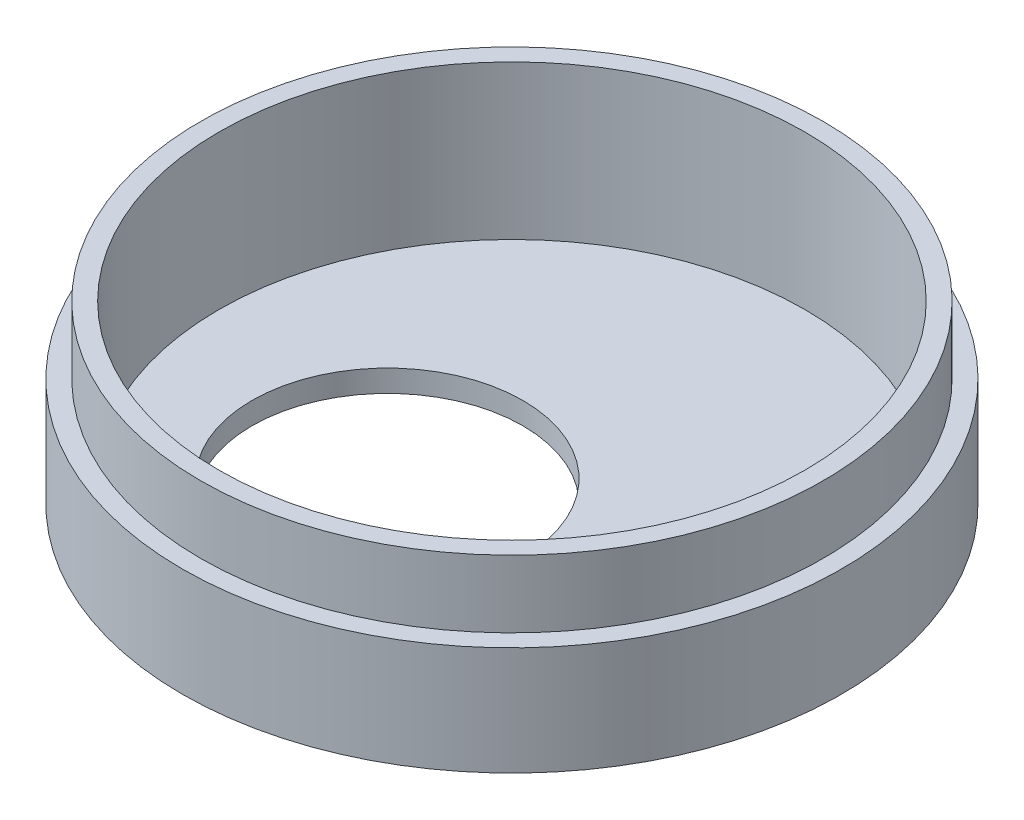
ISO-10303-21;
HEADER;
FILE_DESCRIPTION(('STEP AP214'),'2;1');
FILE_NAME('part.step','',(''),(''),'','','');
FILE_SCHEMA(('AUTOMOTIVE_DESIGN { 1 0 10303 214 1 1 1 1 }'));
ENDSEC;
DATA;
#1=APPLICATION_CONTEXT('core data for automotive mechanical design processes');
#2=APPLICATION_PROTOCOL_DEFINITION('international standard','automotive_design',2000,#1);
#3=PRODUCT_CONTEXT('',#1,'mechanical');
#4=PRODUCT('Part','Part','',(#3));
#5=PRODUCT_RELATED_PRODUCT_CATEGORY('part','',(#4));
#6=PRODUCT_DEFINITION_FORMATION('','',#4);
#7=PRODUCT_DEFINITION_CONTEXT('part definition',#1,'design');
#8=PRODUCT_DEFINITION('design','',#6,#7);
#9=PRODUCT_DEFINITION_SHAPE('','',#8);
#10=(LENGTH_UNIT() NAMED_UNIT(*) SI_UNIT(.MILLI.,.METRE.));
#11=(NAMED_UNIT(*) PLANE_ANGLE_UNIT() SI_UNIT($,.RADIAN.));
#12=(NAMED_UNIT(*) SI_UNIT($,.STERADIAN.) SOLID_ANGLE_UNIT());
#13=UNCERTAINTY_MEASURE_WITH_UNIT(LENGTH_MEASURE(1.E-05),#10,'distance_accuracy_value','');
#14=(GEOMETRIC_REPRESENTATION_CONTEXT(3) GLOBAL_UNCERTAINTY_ASSIGNED_CONTEXT((#13)) GLOBAL_UNIT_ASSIGNED_CONTEXT((#10,
#11,#12)) REPRESENTATION_CONTEXT('',''));
#15=CARTESIAN_POINT('',(0.,0.,0.));
#16=DIRECTION('',(0.,0.,1.));
#17=DIRECTION('',(1.,0.,0.));
#18=AXIS2_PLACEMENT_3D('',#15,#16,#17);
#19=CARTESIAN_POINT('',(0.,-6.00075,0.));
#20=DIRECTION('',(0.,-1.,0.));
#21=DIRECTION('',(0.,0.,-1.));
#22=AXIS2_PLACEMENT_3D('',#19,#20,#21);
#23=PLANE('',#22);
#24=CARTESIAN_POINT('',(-4.318,-6.00075,4.318));
#25=DIRECTION('',(0.,-1.,0.));
#26=DIRECTION('',(0.,0.,-1.));
#27=AXIS2_PLACEMENT_3D('',#24,#25,#26);
#28=CIRCLE('',#27,9.398);
#29=CARTESIAN_POINT('',(-4.318,-6.00075,-5.08));
#30=VERTEX_POINT('',#29);
#31=EDGE_CURVE('E54',#30,#30,#28,.T.);
#32=ORIENTED_EDGE('',*,*,#31,.T.);
#33=EDGE_LOOP('',(#32));
#34=FACE_BOUND('',#33,.T.);
#35=CARTESIAN_POINT('',(0.,-6.00075,0.));
#36=DIRECTION('',(0.,-1.,0.));
#37=DIRECTION('',(0.,0.,-1.));
#38=AXIS2_PLACEMENT_3D('',#35,#36,#37);
#39=CIRCLE('',#38,20.32);
#40=CARTESIAN_POINT('',(0.,-6.00075,-20.32));
#41=VERTEX_POINT('',#40);
#42=EDGE_CURVE('E10',#41,#41,#39,.T.);
#43=ORIENTED_EDGE('',*,*,#42,.F.);
#44=EDGE_LOOP('',(#43));
#45=FACE_BOUND('',#44,.T.);
#46=ADVANCED_FACE('F35',(#34,#45),#23,.F.);
#47=CARTESIAN_POINT('',(0.,33.2676701737178,0.));
#48=DIRECTION('',(0.,1.,0.));
#49=DIRECTION('',(0.,0.,1.));
#50=AXIS2_PLACEMENT_3D('',#47,#48,#49);
#51=CYLINDRICAL_SURFACE('',#50,22.86);
#52=CARTESIAN_POINT('',(0.,0.,0.));
#53=DIRECTION('',(0.,1.,0.));
#54=DIRECTION('',(0.,0.,1.));
#55=AXIS2_PLACEMENT_3D('',#52,#53,#54);
#56=CIRCLE('',#55,22.86);
#57=CARTESIAN_POINT('',(0.,0.,22.86));
#58=VERTEX_POINT('',#57);
#59=EDGE_CURVE('E42',#58,#58,#56,.T.);
#60=ORIENTED_EDGE('',*,*,#59,.F.);
#61=EDGE_LOOP('',(#60));
#62=FACE_BOUND('',#61,.T.);
#63=CARTESIAN_POINT('',(0.,-7.52475,0.));
#64=DIRECTION('',(0.,1.,0.));
#65=DIRECTION('',(0.,0.,1.));
#66=AXIS2_PLACEMENT_3D('',#63,#64,#65);
#67=CIRCLE('',#66,22.86);
#68=CARTESIAN_POINT('',(0.,-7.52475,22.86));
#69=VERTEX_POINT('',#68);
#70=EDGE_CURVE('E46',#69,#69,#67,.T.);
#71=ORIENTED_EDGE('',*,*,#70,.T.);
#72=EDGE_LOOP('',(#71));
#73=FACE_BOUND('',#72,.T.);
#74=ADVANCED_FACE('F37',(#62,#73),#51,.T.);
#75=CARTESIAN_POINT('',(22.86,-7.52475,0.));
#76=DIRECTION('',(0.,1.,0.));
#77=DIRECTION('',(0.,0.,1.));
#78=AXIS2_PLACEMENT_3D('',#75,#76,#77);
#79=PLANE('',#78);
#80=CARTESIAN_POINT('',(-4.318,-7.52475,4.318));
#81=DIRECTION('',(0.,-1.,0.));
#82=DIRECTION('',(0.,0.,-1.));
#83=AXIS2_PLACEMENT_3D('',#80,#81,#82);
#84=CIRCLE('',#83,9.398);
#85=CARTESIAN_POINT('',(-4.318,-7.52475,-5.08));
#86=VERTEX_POINT('',#85);
#87=EDGE_CURVE('E57',#86,#86,#84,.T.);
#88=ORIENTED_EDGE('',*,*,#87,.F.);
#89=EDGE_LOOP('',(#88));
#90=FACE_BOUND('',#89,.T.);
#91=ORIENTED_EDGE('',*,*,#70,.F.);
#92=EDGE_LOOP('',(#91));
#93=FACE_BOUND('',#92,.T.);
#94=ADVANCED_FACE('F87',(#90,#93),#79,.F.);
#95=CARTESIAN_POINT('',(0.,33.2676701737178,0.));
#96=DIRECTION('',(0.,1.,0.));
#97=DIRECTION('',(0.,0.,1.));
#98=AXIS2_PLACEMENT_3D('',#95,#96,#97);
#99=CYLINDRICAL_SURFACE('',#98,21.59);
#100=CARTESIAN_POINT('',(0.,0.,0.));
#101=DIRECTION('',(0.,1.,0.));
#102=DIRECTION('',(0.,0.,1.));
#103=AXIS2_PLACEMENT_3D('',#100,#101,#102);
#104=CIRCLE('',#103,21.59);
#105=CARTESIAN_POINT('',(0.,0.,21.59));
#106=VERTEX_POINT('',#105);
#107=EDGE_CURVE('E51',#106,#106,#104,.T.);
#108=ORIENTED_EDGE('',*,*,#107,.T.);
#109=EDGE_LOOP('',(#108));
#110=FACE_BOUND('',#109,.T.);
#111=CARTESIAN_POINT('',(0.,4.66725,0.));
#112=DIRECTION('',(0.,1.,0.));
#113=DIRECTION('',(0.,0.,1.));
#114=AXIS2_PLACEMENT_3D('',#111,#112,#113);
#115=CIRCLE('',#114,21.59);
#116=CARTESIAN_POINT('',(0.,4.66725,21.59));
#117=VERTEX_POINT('',#116);
#118=EDGE_CURVE('E56',#117,#117,#115,.T.);
#119=ORIENTED_EDGE('',*,*,#118,.F.);
#120=EDGE_LOOP('',(#119));
#121=FACE_BOUND('',#120,.T.);
#122=ADVANCED_FACE('F72',(#110,#121),#99,.T.);
#123=CARTESIAN_POINT('',(21.59,0.,0.));
#124=DIRECTION('',(0.,-1.,0.));
#125=DIRECTION('',(0.,0.,-1.));
#126=AXIS2_PLACEMENT_3D('',#123,#124,#125);
#127=PLANE('',#126);
#128=ORIENTED_EDGE('',*,*,#107,.F.);
#129=EDGE_LOOP('',(#128));
#130=FACE_BOUND('',#129,.T.);
#131=ORIENTED_EDGE('',*,*,#59,.T.);
#132=EDGE_LOOP('',(#131));
#133=FACE_BOUND('',#132,.T.);
#134=ADVANCED_FACE('F75',(#130,#133),#127,.F.);
#135=CARTESIAN_POINT('',(20.955,4.66725,0.));
#136=DIRECTION('',(0.,-1.,0.));
#137=DIRECTION('',(0.,0.,-1.));
#138=AXIS2_PLACEMENT_3D('',#135,#136,#137);
#139=PLANE('',#138);
#140=ORIENTED_EDGE('',*,*,#118,.T.);
#141=EDGE_LOOP('',(#140));
#142=FACE_BOUND('',#141,.T.);
#143=CARTESIAN_POINT('',(0.,4.66725,0.));
#144=DIRECTION('',(0.,1.,0.));
#145=DIRECTION('',(0.,0.,1.));
#146=AXIS2_PLACEMENT_3D('',#143,#144,#145);
#147=CIRCLE('',#146,20.32);
#148=CARTESIAN_POINT('',(0.,4.66725,20.32));
#149=VERTEX_POINT('',#148);
#150=EDGE_CURVE('E63',#149,#149,#147,.T.);
#151=ORIENTED_EDGE('',*,*,#150,.F.);
#152=EDGE_LOOP('',(#151));
#153=FACE_BOUND('',#152,.T.);
#154=ADVANCED_FACE('F77',(#142,#153),#139,.F.);
#155=CARTESIAN_POINT('',(-4.318,4.66725,4.318));
#156=DIRECTION('',(0.,-1.,0.));
#157=DIRECTION('',(0.,0.,-1.));
#158=AXIS2_PLACEMENT_3D('',#155,#156,#157);
#159=CYLINDRICAL_SURFACE('',#158,9.398);
#160=ORIENTED_EDGE('',*,*,#87,.T.);
#161=EDGE_LOOP('',(#160));
#162=FACE_BOUND('',#161,.T.);
#163=ORIENTED_EDGE('',*,*,#31,.F.);
#164=EDGE_LOOP('',(#163));
#165=FACE_BOUND('',#164,.T.);
#166=ADVANCED_FACE('F84',(#162,#165),#159,.F.);
#167=CARTESIAN_POINT('',(0.,-65.2704403990564,0.));
#168=DIRECTION('',(0.,1.,0.));
#169=DIRECTION('',(0.,0.,1.));
#170=AXIS2_PLACEMENT_3D('',#167,#168,#169);
#171=CYLINDRICAL_SURFACE('',#170,20.32);
#172=ORIENTED_EDGE('',*,*,#150,.T.);
#173=EDGE_LOOP('',(#172));
#174=FACE_BOUND('',#173,.T.);
#175=ORIENTED_EDGE('',*,*,#42,.T.);
#176=EDGE_LOOP('',(#175));
#177=FACE_BOUND('',#176,.T.);
#178=ADVANCED_FACE('F145',(#174,#177),#171,.F.);
#179=CLOSED_SHELL('',(#46,#74,#94,#122,#134,#154,#166,#178));
#180=MANIFOLD_SOLID_BREP('B2',#179);
#181=ADVANCED_BREP_SHAPE_REPRESENTATION('',(#18,#180),#14);
#182=SHAPE_DEFINITION_REPRESENTATION(#9,#181);
ENDSEC;
END-ISO-10303-21;
